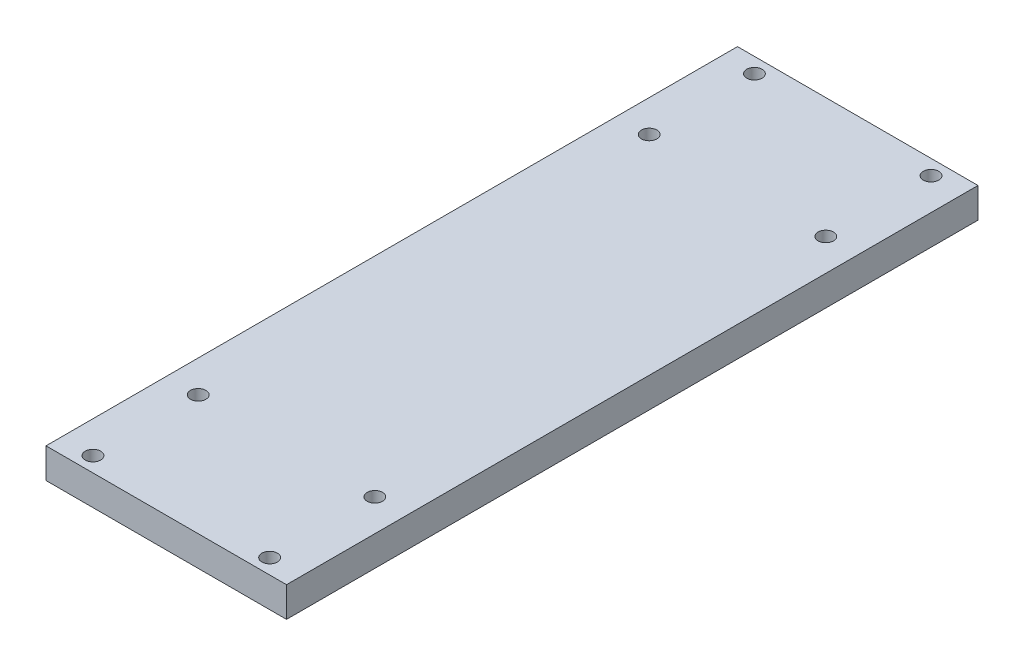
ISO-10303-21;
HEADER;
FILE_DESCRIPTION(('STEP AP214'),'2;1');
FILE_NAME('part.step','',(''),(''),'','','');
FILE_SCHEMA(('AUTOMOTIVE_DESIGN { 1 0 10303 214 1 1 1 1 }'));
ENDSEC;
DATA;
#1=APPLICATION_CONTEXT('core data for automotive mechanical design processes');
#2=APPLICATION_PROTOCOL_DEFINITION('international standard','automotive_design',2000,#1);
#3=PRODUCT_CONTEXT('',#1,'mechanical');
#4=PRODUCT('Part','Part','',(#3));
#5=PRODUCT_RELATED_PRODUCT_CATEGORY('part','',(#4));
#6=PRODUCT_DEFINITION_FORMATION('','',#4);
#7=PRODUCT_DEFINITION_CONTEXT('part definition',#1,'design');
#8=PRODUCT_DEFINITION('design','',#6,#7);
#9=PRODUCT_DEFINITION_SHAPE('','',#8);
#10=(LENGTH_UNIT() NAMED_UNIT(*) SI_UNIT(.MILLI.,.METRE.));
#11=(NAMED_UNIT(*) PLANE_ANGLE_UNIT() SI_UNIT($,.RADIAN.));
#12=(NAMED_UNIT(*) SI_UNIT($,.STERADIAN.) SOLID_ANGLE_UNIT());
#13=UNCERTAINTY_MEASURE_WITH_UNIT(LENGTH_MEASURE(1.E-05),#10,'distance_accuracy_value','');
#14=(GEOMETRIC_REPRESENTATION_CONTEXT(3) GLOBAL_UNCERTAINTY_ASSIGNED_CONTEXT((#13)) GLOBAL_UNIT_ASSIGNED_CONTEXT((#10,
#11,#12)) REPRESENTATION_CONTEXT('',''));
#15=CARTESIAN_POINT('',(0.,0.,0.));
#16=DIRECTION('',(0.,0.,1.));
#17=DIRECTION('',(1.,0.,0.));
#18=AXIS2_PLACEMENT_3D('',#15,#16,#17);
#19=CARTESIAN_POINT('',(0.,12.7,0.));
#20=DIRECTION('',(1.,0.,0.));
#21=DIRECTION('',(0.,0.,-1.));
#22=AXIS2_PLACEMENT_3D('',#19,#20,#21);
#23=PLANE('',#22);
#24=DIRECTION('',(0.,0.,1.));
#25=VECTOR('',#24,1.);
#26=CARTESIAN_POINT('',(0.,0.,0.));
#27=LINE('',#26,#25);
#28=CARTESIAN_POINT('',(0.,0.,-292.1));
#29=VERTEX_POINT('',#28);
#30=CARTESIAN_POINT('',(0.,0.,0.));
#31=VERTEX_POINT('',#30);
#32=EDGE_CURVE('E99',#29,#31,#27,.T.);
#33=ORIENTED_EDGE('',*,*,#32,.T.);
#34=DIRECTION('',(0.,-1.,0.));
#35=VECTOR('',#34,1.);
#36=CARTESIAN_POINT('',(0.,12.7,0.));
#37=LINE('',#36,#35);
#38=CARTESIAN_POINT('',(0.,12.7,0.));
#39=VERTEX_POINT('',#38);
#40=EDGE_CURVE('E11',#39,#31,#37,.T.);
#41=ORIENTED_EDGE('',*,*,#40,.F.);
#42=DIRECTION('',(0.,0.,1.));
#43=VECTOR('',#42,1.);
#44=CARTESIAN_POINT('',(0.,12.7,0.));
#45=LINE('',#44,#43);
#46=CARTESIAN_POINT('',(0.,12.7,-292.1));
#47=VERTEX_POINT('',#46);
#48=EDGE_CURVE('E87',#47,#39,#45,.T.);
#49=ORIENTED_EDGE('',*,*,#48,.F.);
#50=DIRECTION('',(0.,-1.,0.));
#51=VECTOR('',#50,1.);
#52=CARTESIAN_POINT('',(0.,12.7,-292.1));
#53=LINE('',#52,#51);
#54=EDGE_CURVE('E95',#47,#29,#53,.T.);
#55=ORIENTED_EDGE('',*,*,#54,.T.);
#56=EDGE_LOOP('',(#33,#41,#49,#55));
#57=FACE_BOUND('',#56,.T.);
#58=ADVANCED_FACE('F36',(#57),#23,.F.);
#59=CARTESIAN_POINT('',(0.,12.7,0.));
#60=DIRECTION('',(0.,0.,-1.));
#61=DIRECTION('',(-1.,0.,0.));
#62=AXIS2_PLACEMENT_3D('',#59,#60,#61);
#63=PLANE('',#62);
#64=DIRECTION('',(1.,0.,0.));
#65=VECTOR('',#64,1.);
#66=CARTESIAN_POINT('',(0.,0.,0.));
#67=LINE('',#66,#65);
#68=CARTESIAN_POINT('',(101.6,0.,0.));
#69=VERTEX_POINT('',#68);
#70=EDGE_CURVE('E91',#31,#69,#67,.T.);
#71=ORIENTED_EDGE('',*,*,#70,.T.);
#72=DIRECTION('',(0.,-1.,0.));
#73=VECTOR('',#72,1.);
#74=CARTESIAN_POINT('',(101.6,12.7,0.));
#75=LINE('',#74,#73);
#76=CARTESIAN_POINT('',(101.6,12.7,0.));
#77=VERTEX_POINT('',#76);
#78=EDGE_CURVE('E44',#77,#69,#75,.T.);
#79=ORIENTED_EDGE('',*,*,#78,.F.);
#80=DIRECTION('',(1.,0.,0.));
#81=VECTOR('',#80,1.);
#82=CARTESIAN_POINT('',(0.,12.7,0.));
#83=LINE('',#82,#81);
#84=EDGE_CURVE('E82',#39,#77,#83,.T.);
#85=ORIENTED_EDGE('',*,*,#84,.F.);
#86=ORIENTED_EDGE('',*,*,#40,.T.);
#87=EDGE_LOOP('',(#71,#79,#85,#86));
#88=FACE_BOUND('',#87,.T.);
#89=ADVANCED_FACE('F90',(#88),#63,.F.);
#90=CARTESIAN_POINT('',(101.6,12.7,0.));
#91=DIRECTION('',(-1.,0.,0.));
#92=DIRECTION('',(0.,0.,1.));
#93=AXIS2_PLACEMENT_3D('',#90,#91,#92);
#94=PLANE('',#93);
#95=DIRECTION('',(0.,0.,-1.));
#96=VECTOR('',#95,1.);
#97=CARTESIAN_POINT('',(101.6,0.,0.));
#98=LINE('',#97,#96);
#99=CARTESIAN_POINT('',(101.6,0.,-292.1));
#100=VERTEX_POINT('',#99);
#101=EDGE_CURVE('E69',#69,#100,#98,.T.);
#102=ORIENTED_EDGE('',*,*,#101,.T.);
#103=DIRECTION('',(0.,-1.,0.));
#104=VECTOR('',#103,1.);
#105=CARTESIAN_POINT('',(101.6,12.7,-292.1));
#106=LINE('',#105,#104);
#107=CARTESIAN_POINT('',(101.6,12.7,-292.1));
#108=VERTEX_POINT('',#107);
#109=EDGE_CURVE('E92',#108,#100,#106,.T.);
#110=ORIENTED_EDGE('',*,*,#109,.F.);
#111=DIRECTION('',(0.,0.,-1.));
#112=VECTOR('',#111,1.);
#113=CARTESIAN_POINT('',(101.6,12.7,0.));
#114=LINE('',#113,#112);
#115=EDGE_CURVE('E85',#77,#108,#114,.T.);
#116=ORIENTED_EDGE('',*,*,#115,.F.);
#117=ORIENTED_EDGE('',*,*,#78,.T.);
#118=EDGE_LOOP('',(#102,#110,#116,#117));
#119=FACE_BOUND('',#118,.T.);
#120=ADVANCED_FACE('F93',(#119),#94,.F.);
#121=CARTESIAN_POINT('',(0.,12.7,-292.1));
#122=DIRECTION('',(0.,0.,1.));
#123=DIRECTION('',(1.,0.,0.));
#124=AXIS2_PLACEMENT_3D('',#121,#122,#123);
#125=PLANE('',#124);
#126=DIRECTION('',(-1.,0.,0.));
#127=VECTOR('',#126,1.);
#128=CARTESIAN_POINT('',(0.,0.,-292.1));
#129=LINE('',#128,#127);
#130=EDGE_CURVE('E75',#100,#29,#129,.T.);
#131=ORIENTED_EDGE('',*,*,#130,.T.);
#132=ORIENTED_EDGE('',*,*,#54,.F.);
#133=DIRECTION('',(-1.,0.,0.));
#134=VECTOR('',#133,1.);
#135=CARTESIAN_POINT('',(0.,12.7,-292.1));
#136=LINE('',#135,#134);
#137=EDGE_CURVE('E52',#108,#47,#136,.T.);
#138=ORIENTED_EDGE('',*,*,#137,.F.);
#139=ORIENTED_EDGE('',*,*,#109,.T.);
#140=EDGE_LOOP('',(#131,#132,#138,#139));
#141=FACE_BOUND('',#140,.T.);
#142=ADVANCED_FACE('F107',(#141),#125,.F.);
#143=CARTESIAN_POINT('',(0.,12.7,-292.1));
#144=DIRECTION('',(0.,-1.,0.));
#145=DIRECTION('',(0.,0.,-1.));
#146=AXIS2_PLACEMENT_3D('',#143,#144,#145);
#147=PLANE('',#146);
#148=CARTESIAN_POINT('',(88.10625,12.7,-6.34999999999999));
#149=DIRECTION('',(0.,1.,0.));
#150=DIRECTION('',(0.,0.,1.));
#151=AXIS2_PLACEMENT_3D('',#148,#149,#150);
#152=CIRCLE('',#151,3.26389999999999);
#153=CARTESIAN_POINT('',(88.10625,12.7,-3.08610000000001));
#154=VERTEX_POINT('',#153);
#155=EDGE_CURVE('E154',#154,#154,#152,.T.);
#156=ORIENTED_EDGE('',*,*,#155,.F.);
#157=EDGE_LOOP('',(#156));
#158=FACE_BOUND('',#157,.T.);
#159=CARTESIAN_POINT('',(13.49375,12.7,-241.3));
#160=DIRECTION('',(0.,1.,0.));
#161=DIRECTION('',(0.,0.,1.));
#162=AXIS2_PLACEMENT_3D('',#159,#160,#161);
#163=CIRCLE('',#162,3.26389999999999);
#164=CARTESIAN_POINT('',(13.49375,12.7,-238.0361));
#165=VERTEX_POINT('',#164);
#166=EDGE_CURVE('E148',#165,#165,#163,.T.);
#167=ORIENTED_EDGE('',*,*,#166,.F.);
#168=EDGE_LOOP('',(#167));
#169=FACE_BOUND('',#168,.T.);
#170=CARTESIAN_POINT('',(88.10625,12.7,-241.3));
#171=DIRECTION('',(0.,1.,0.));
#172=DIRECTION('',(0.,0.,1.));
#173=AXIS2_PLACEMENT_3D('',#170,#171,#172);
#174=CIRCLE('',#173,3.26389999999999);
#175=CARTESIAN_POINT('',(88.10625,12.7,-238.0361));
#176=VERTEX_POINT('',#175);
#177=EDGE_CURVE('E142',#176,#176,#174,.T.);
#178=ORIENTED_EDGE('',*,*,#177,.F.);
#179=EDGE_LOOP('',(#178));
#180=FACE_BOUND('',#179,.T.);
#181=CARTESIAN_POINT('',(88.10625,12.7,-285.75));
#182=DIRECTION('',(0.,1.,0.));
#183=DIRECTION('',(0.,0.,1.));
#184=AXIS2_PLACEMENT_3D('',#181,#182,#183);
#185=CIRCLE('',#184,3.26389999999999);
#186=CARTESIAN_POINT('',(88.10625,12.7,-282.4861));
#187=VERTEX_POINT('',#186);
#188=EDGE_CURVE('E136',#187,#187,#185,.T.);
#189=ORIENTED_EDGE('',*,*,#188,.F.);
#190=EDGE_LOOP('',(#189));
#191=FACE_BOUND('',#190,.T.);
#192=CARTESIAN_POINT('',(13.49375,12.7,-285.75));
#193=DIRECTION('',(0.,1.,0.));
#194=DIRECTION('',(0.,0.,1.));
#195=AXIS2_PLACEMENT_3D('',#192,#193,#194);
#196=CIRCLE('',#195,3.26389999999999);
#197=CARTESIAN_POINT('',(13.49375,12.7,-282.4861));
#198=VERTEX_POINT('',#197);
#199=EDGE_CURVE('E130',#198,#198,#196,.T.);
#200=ORIENTED_EDGE('',*,*,#199,.F.);
#201=EDGE_LOOP('',(#200));
#202=FACE_BOUND('',#201,.T.);
#203=CARTESIAN_POINT('',(88.10625,12.7,-50.8));
#204=DIRECTION('',(0.,1.,0.));
#205=DIRECTION('',(0.,0.,1.));
#206=AXIS2_PLACEMENT_3D('',#203,#204,#205);
#207=CIRCLE('',#206,3.26389999999999);
#208=CARTESIAN_POINT('',(88.10625,12.7,-47.5361));
#209=VERTEX_POINT('',#208);
#210=EDGE_CURVE('E124',#209,#209,#207,.T.);
#211=ORIENTED_EDGE('',*,*,#210,.F.);
#212=EDGE_LOOP('',(#211));
#213=FACE_BOUND('',#212,.T.);
#214=CARTESIAN_POINT('',(13.49375,12.7,-50.8));
#215=DIRECTION('',(0.,1.,0.));
#216=DIRECTION('',(0.,0.,1.));
#217=AXIS2_PLACEMENT_3D('',#214,#215,#216);
#218=CIRCLE('',#217,3.26389999999999);
#219=CARTESIAN_POINT('',(13.49375,12.7,-47.5361));
#220=VERTEX_POINT('',#219);
#221=EDGE_CURVE('E118',#220,#220,#218,.T.);
#222=ORIENTED_EDGE('',*,*,#221,.F.);
#223=EDGE_LOOP('',(#222));
#224=FACE_BOUND('',#223,.T.);
#225=CARTESIAN_POINT('',(13.49375,12.7,-6.34999999999999));
#226=DIRECTION('',(0.,1.,0.));
#227=DIRECTION('',(0.,0.,1.));
#228=AXIS2_PLACEMENT_3D('',#225,#226,#227);
#229=CIRCLE('',#228,3.26389999999999);
#230=CARTESIAN_POINT('',(13.49375,12.7,-3.08610000000001));
#231=VERTEX_POINT('',#230);
#232=EDGE_CURVE('E102',#231,#231,#229,.T.);
#233=ORIENTED_EDGE('',*,*,#232,.F.);
#234=EDGE_LOOP('',(#233));
#235=FACE_BOUND('',#234,.T.);
#236=ORIENTED_EDGE('',*,*,#48,.T.);
#237=ORIENTED_EDGE('',*,*,#84,.T.);
#238=ORIENTED_EDGE('',*,*,#115,.T.);
#239=ORIENTED_EDGE('',*,*,#137,.T.);
#240=EDGE_LOOP('',(#236,#237,#238,#239));
#241=FACE_BOUND('',#240,.T.);
#242=ADVANCED_FACE('F83',(#158,#169,#180,#191,#202,#213,#224,#235,#241),#147,.F.);
#243=CARTESIAN_POINT('',(0.,0.,-292.1));
#244=DIRECTION('',(0.,-1.,0.));
#245=DIRECTION('',(0.,0.,-1.));
#246=AXIS2_PLACEMENT_3D('',#243,#244,#245);
#247=PLANE('',#246);
#248=CARTESIAN_POINT('',(88.10625,0.,-6.34999999999999));
#249=DIRECTION('',(0.,1.,0.));
#250=DIRECTION('',(0.,0.,1.));
#251=AXIS2_PLACEMENT_3D('',#248,#249,#250);
#252=CIRCLE('',#251,3.2639);
#253=CARTESIAN_POINT('',(88.10625,0.,-3.08609999999999));
#254=VERTEX_POINT('',#253);
#255=EDGE_CURVE('E157',#254,#254,#252,.T.);
#256=ORIENTED_EDGE('',*,*,#255,.T.);
#257=EDGE_LOOP('',(#256));
#258=FACE_BOUND('',#257,.T.);
#259=CARTESIAN_POINT('',(13.49375,0.,-241.3));
#260=DIRECTION('',(0.,1.,0.));
#261=DIRECTION('',(0.,0.,1.));
#262=AXIS2_PLACEMENT_3D('',#259,#260,#261);
#263=CIRCLE('',#262,3.2639);
#264=CARTESIAN_POINT('',(13.49375,0.,-238.0361));
#265=VERTEX_POINT('',#264);
#266=EDGE_CURVE('E151',#265,#265,#263,.T.);
#267=ORIENTED_EDGE('',*,*,#266,.T.);
#268=EDGE_LOOP('',(#267));
#269=FACE_BOUND('',#268,.T.);
#270=CARTESIAN_POINT('',(88.10625,0.,-241.3));
#271=DIRECTION('',(0.,1.,0.));
#272=DIRECTION('',(0.,0.,1.));
#273=AXIS2_PLACEMENT_3D('',#270,#271,#272);
#274=CIRCLE('',#273,3.2639);
#275=CARTESIAN_POINT('',(88.10625,0.,-238.0361));
#276=VERTEX_POINT('',#275);
#277=EDGE_CURVE('E145',#276,#276,#274,.T.);
#278=ORIENTED_EDGE('',*,*,#277,.T.);
#279=EDGE_LOOP('',(#278));
#280=FACE_BOUND('',#279,.T.);
#281=CARTESIAN_POINT('',(88.10625,0.,-285.75));
#282=DIRECTION('',(0.,1.,0.));
#283=DIRECTION('',(0.,0.,1.));
#284=AXIS2_PLACEMENT_3D('',#281,#282,#283);
#285=CIRCLE('',#284,3.2639);
#286=CARTESIAN_POINT('',(88.10625,0.,-282.4861));
#287=VERTEX_POINT('',#286);
#288=EDGE_CURVE('E139',#287,#287,#285,.T.);
#289=ORIENTED_EDGE('',*,*,#288,.T.);
#290=EDGE_LOOP('',(#289));
#291=FACE_BOUND('',#290,.T.);
#292=CARTESIAN_POINT('',(13.49375,0.,-285.75));
#293=DIRECTION('',(0.,1.,0.));
#294=DIRECTION('',(0.,0.,1.));
#295=AXIS2_PLACEMENT_3D('',#292,#293,#294);
#296=CIRCLE('',#295,3.2639);
#297=CARTESIAN_POINT('',(13.49375,0.,-282.4861));
#298=VERTEX_POINT('',#297);
#299=EDGE_CURVE('E133',#298,#298,#296,.T.);
#300=ORIENTED_EDGE('',*,*,#299,.T.);
#301=EDGE_LOOP('',(#300));
#302=FACE_BOUND('',#301,.T.);
#303=CARTESIAN_POINT('',(88.10625,0.,-50.8));
#304=DIRECTION('',(0.,1.,0.));
#305=DIRECTION('',(0.,0.,1.));
#306=AXIS2_PLACEMENT_3D('',#303,#304,#305);
#307=CIRCLE('',#306,3.2639);
#308=CARTESIAN_POINT('',(88.10625,0.,-47.5361));
#309=VERTEX_POINT('',#308);
#310=EDGE_CURVE('E127',#309,#309,#307,.T.);
#311=ORIENTED_EDGE('',*,*,#310,.T.);
#312=EDGE_LOOP('',(#311));
#313=FACE_BOUND('',#312,.T.);
#314=CARTESIAN_POINT('',(13.49375,0.,-50.8));
#315=DIRECTION('',(0.,1.,0.));
#316=DIRECTION('',(0.,0.,1.));
#317=AXIS2_PLACEMENT_3D('',#314,#315,#316);
#318=CIRCLE('',#317,3.2639);
#319=CARTESIAN_POINT('',(13.49375,0.,-47.5361));
#320=VERTEX_POINT('',#319);
#321=EDGE_CURVE('E121',#320,#320,#318,.T.);
#322=ORIENTED_EDGE('',*,*,#321,.T.);
#323=EDGE_LOOP('',(#322));
#324=FACE_BOUND('',#323,.T.);
#325=CARTESIAN_POINT('',(13.49375,0.,-6.34999999999999));
#326=DIRECTION('',(0.,1.,0.));
#327=DIRECTION('',(0.,0.,1.));
#328=AXIS2_PLACEMENT_3D('',#325,#326,#327);
#329=CIRCLE('',#328,3.2639);
#330=CARTESIAN_POINT('',(13.49375,0.,-3.0861));
#331=VERTEX_POINT('',#330);
#332=EDGE_CURVE('E115',#331,#331,#329,.T.);
#333=ORIENTED_EDGE('',*,*,#332,.T.);
#334=EDGE_LOOP('',(#333));
#335=FACE_BOUND('',#334,.T.);
#336=ORIENTED_EDGE('',*,*,#32,.F.);
#337=ORIENTED_EDGE('',*,*,#130,.F.);
#338=ORIENTED_EDGE('',*,*,#101,.F.);
#339=ORIENTED_EDGE('',*,*,#70,.F.);
#340=EDGE_LOOP('',(#336,#337,#338,#339));
#341=FACE_BOUND('',#340,.T.);
#342=ADVANCED_FACE('F110',(#258,#269,#280,#291,#302,#313,#324,#335,#341),#247,.T.);
#343=CARTESIAN_POINT('',(13.49375,12.7,-6.34999999999999));
#344=DIRECTION('',(0.,1.,0.));
#345=DIRECTION('',(0.,0.,1.));
#346=AXIS2_PLACEMENT_3D('',#343,#344,#345);
#347=CYLINDRICAL_SURFACE('',#346,3.26389999999999);
#348=ORIENTED_EDGE('',*,*,#332,.F.);
#349=EDGE_LOOP('',(#348));
#350=FACE_BOUND('',#349,.T.);
#351=ORIENTED_EDGE('',*,*,#232,.T.);
#352=EDGE_LOOP('',(#351));
#353=FACE_BOUND('',#352,.T.);
#354=ADVANCED_FACE('F187',(#350,#353),#347,.F.);
#355=CARTESIAN_POINT('',(13.49375,12.7,-50.8));
#356=DIRECTION('',(0.,1.,0.));
#357=DIRECTION('',(0.,0.,1.));
#358=AXIS2_PLACEMENT_3D('',#355,#356,#357);
#359=CYLINDRICAL_SURFACE('',#358,3.26389999999999);
#360=ORIENTED_EDGE('',*,*,#321,.F.);
#361=EDGE_LOOP('',(#360));
#362=FACE_BOUND('',#361,.T.);
#363=ORIENTED_EDGE('',*,*,#221,.T.);
#364=EDGE_LOOP('',(#363));
#365=FACE_BOUND('',#364,.T.);
#366=ADVANCED_FACE('F189',(#362,#365),#359,.F.);
#367=CARTESIAN_POINT('',(88.10625,12.7,-50.8));
#368=DIRECTION('',(0.,1.,0.));
#369=DIRECTION('',(0.,0.,1.));
#370=AXIS2_PLACEMENT_3D('',#367,#368,#369);
#371=CYLINDRICAL_SURFACE('',#370,3.26389999999999);
#372=ORIENTED_EDGE('',*,*,#310,.F.);
#373=EDGE_LOOP('',(#372));
#374=FACE_BOUND('',#373,.T.);
#375=ORIENTED_EDGE('',*,*,#210,.T.);
#376=EDGE_LOOP('',(#375));
#377=FACE_BOUND('',#376,.T.);
#378=ADVANCED_FACE('F196',(#374,#377),#371,.F.);
#379=CARTESIAN_POINT('',(13.49375,12.7,-285.75));
#380=DIRECTION('',(0.,1.,0.));
#381=DIRECTION('',(0.,0.,1.));
#382=AXIS2_PLACEMENT_3D('',#379,#380,#381);
#383=CYLINDRICAL_SURFACE('',#382,3.26389999999999);
#384=ORIENTED_EDGE('',*,*,#299,.F.);
#385=EDGE_LOOP('',(#384));
#386=FACE_BOUND('',#385,.T.);
#387=ORIENTED_EDGE('',*,*,#199,.T.);
#388=EDGE_LOOP('',(#387));
#389=FACE_BOUND('',#388,.T.);
#390=ADVANCED_FACE('F246',(#386,#389),#383,.F.);
#391=CARTESIAN_POINT('',(88.10625,12.7,-285.75));
#392=DIRECTION('',(0.,1.,0.));
#393=DIRECTION('',(0.,0.,1.));
#394=AXIS2_PLACEMENT_3D('',#391,#392,#393);
#395=CYLINDRICAL_SURFACE('',#394,3.26389999999999);
#396=ORIENTED_EDGE('',*,*,#288,.F.);
#397=EDGE_LOOP('',(#396));
#398=FACE_BOUND('',#397,.T.);
#399=ORIENTED_EDGE('',*,*,#188,.T.);
#400=EDGE_LOOP('',(#399));
#401=FACE_BOUND('',#400,.T.);
#402=ADVANCED_FACE('F257',(#398,#401),#395,.F.);
#403=CARTESIAN_POINT('',(88.10625,12.7,-241.3));
#404=DIRECTION('',(0.,1.,0.));
#405=DIRECTION('',(0.,0.,1.));
#406=AXIS2_PLACEMENT_3D('',#403,#404,#405);
#407=CYLINDRICAL_SURFACE('',#406,3.26389999999999);
#408=ORIENTED_EDGE('',*,*,#277,.F.);
#409=EDGE_LOOP('',(#408));
#410=FACE_BOUND('',#409,.T.);
#411=ORIENTED_EDGE('',*,*,#177,.T.);
#412=EDGE_LOOP('',(#411));
#413=FACE_BOUND('',#412,.T.);
#414=ADVANCED_FACE('F268',(#410,#413),#407,.F.);
#415=CARTESIAN_POINT('',(13.49375,12.7,-241.3));
#416=DIRECTION('',(0.,1.,0.));
#417=DIRECTION('',(0.,0.,1.));
#418=AXIS2_PLACEMENT_3D('',#415,#416,#417);
#419=CYLINDRICAL_SURFACE('',#418,3.26389999999999);
#420=ORIENTED_EDGE('',*,*,#266,.F.);
#421=EDGE_LOOP('',(#420));
#422=FACE_BOUND('',#421,.T.);
#423=ORIENTED_EDGE('',*,*,#166,.T.);
#424=EDGE_LOOP('',(#423));
#425=FACE_BOUND('',#424,.T.);
#426=ADVANCED_FACE('F166',(#422,#425),#419,.F.);
#427=CARTESIAN_POINT('',(88.10625,12.7,-6.34999999999999));
#428=DIRECTION('',(0.,1.,0.));
#429=DIRECTION('',(0.,0.,1.));
#430=AXIS2_PLACEMENT_3D('',#427,#428,#429);
#431=CYLINDRICAL_SURFACE('',#430,3.26389999999999);
#432=ORIENTED_EDGE('',*,*,#255,.F.);
#433=EDGE_LOOP('',(#432));
#434=FACE_BOUND('',#433,.T.);
#435=ORIENTED_EDGE('',*,*,#155,.T.);
#436=EDGE_LOOP('',(#435));
#437=FACE_BOUND('',#436,.T.);
#438=ADVANCED_FACE('F163',(#434,#437),#431,.F.);
#439=CLOSED_SHELL('',(#58,#89,#120,#142,#242,#342,#354,#366,#378,#390,#402,#414,#426,#438));
#440=MANIFOLD_SOLID_BREP('B2',#439);
#441=ADVANCED_BREP_SHAPE_REPRESENTATION('',(#18,#440),#14);
#442=SHAPE_DEFINITION_REPRESENTATION(#9,#441);
ENDSEC;
END-ISO-10303-21;
